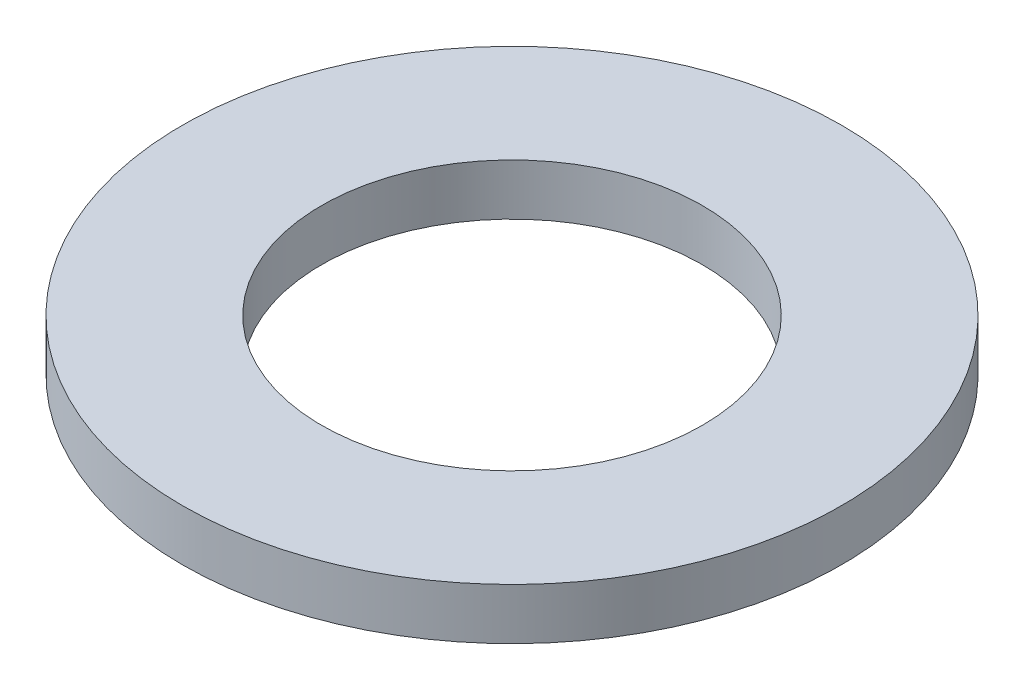
ISO-10303-21;
HEADER;
FILE_DESCRIPTION(('STEP AP214'),'2;1');
FILE_NAME('part.step','',(''),(''),'','','');
FILE_SCHEMA(('AUTOMOTIVE_DESIGN { 1 0 10303 214 1 1 1 1 }'));
ENDSEC;
DATA;
#1=APPLICATION_CONTEXT('core data for automotive mechanical design processes');
#2=APPLICATION_PROTOCOL_DEFINITION('international standard','automotive_design',2000,#1);
#3=PRODUCT_CONTEXT('',#1,'mechanical');
#4=PRODUCT('Part','Part','',(#3));
#5=PRODUCT_RELATED_PRODUCT_CATEGORY('part','',(#4));
#6=PRODUCT_DEFINITION_FORMATION('','',#4);
#7=PRODUCT_DEFINITION_CONTEXT('part definition',#1,'design');
#8=PRODUCT_DEFINITION('design','',#6,#7);
#9=PRODUCT_DEFINITION_SHAPE('','',#8);
#10=(LENGTH_UNIT() NAMED_UNIT(*) SI_UNIT(.MILLI.,.METRE.));
#11=(NAMED_UNIT(*) PLANE_ANGLE_UNIT() SI_UNIT($,.RADIAN.));
#12=(NAMED_UNIT(*) SI_UNIT($,.STERADIAN.) SOLID_ANGLE_UNIT());
#13=UNCERTAINTY_MEASURE_WITH_UNIT(LENGTH_MEASURE(1.E-05),#10,'distance_accuracy_value','');
#14=(GEOMETRIC_REPRESENTATION_CONTEXT(3) GLOBAL_UNCERTAINTY_ASSIGNED_CONTEXT((#13)) GLOBAL_UNIT_ASSIGNED_CONTEXT((#10,
#11,#12)) REPRESENTATION_CONTEXT('',''));
#15=CARTESIAN_POINT('',(0.,0.,0.));
#16=DIRECTION('',(0.,0.,1.));
#17=DIRECTION('',(1.,0.,0.));
#18=AXIS2_PLACEMENT_3D('',#15,#16,#17);
#19=CARTESIAN_POINT('',(0.,0.7,0.));
#20=DIRECTION('',(0.,1.,0.));
#21=DIRECTION('',(0.,0.,1.));
#22=AXIS2_PLACEMENT_3D('',#19,#20,#21);
#23=PLANE('',#22);
#24=CARTESIAN_POINT('',(0.,0.7,0.));
#25=DIRECTION('',(0.,1.,0.));
#26=DIRECTION('',(0.,0.,1.));
#27=AXIS2_PLACEMENT_3D('',#24,#25,#26);
#28=CIRCLE('',#27,4.5);
#29=CARTESIAN_POINT('',(0.,0.7,4.5));
#30=VERTEX_POINT('',#29);
#31=EDGE_CURVE('E11',#30,#30,#28,.T.);
#32=ORIENTED_EDGE('',*,*,#31,.T.);
#33=EDGE_LOOP('',(#32));
#34=FACE_BOUND('',#33,.T.);
#35=CARTESIAN_POINT('',(0.,0.7,0.));
#36=DIRECTION('',(0.,1.,0.));
#37=DIRECTION('',(1.,0.,0.));
#38=AXIS2_PLACEMENT_3D('',#35,#36,#37);
#39=CIRCLE('',#38,2.6);
#40=CARTESIAN_POINT('',(2.6,0.7,0.));
#41=VERTEX_POINT('',#40);
#42=EDGE_CURVE('E54',#41,#41,#39,.T.);
#43=ORIENTED_EDGE('',*,*,#42,.F.);
#44=EDGE_LOOP('',(#43));
#45=FACE_BOUND('',#44,.T.);
#46=ADVANCED_FACE('F43',(#34,#45),#23,.T.);
#47=CARTESIAN_POINT('',(0.,0.,0.));
#48=DIRECTION('',(0.,1.,0.));
#49=DIRECTION('',(0.,0.,1.));
#50=AXIS2_PLACEMENT_3D('',#47,#48,#49);
#51=PLANE('',#50);
#52=CARTESIAN_POINT('',(0.,0.,0.));
#53=DIRECTION('',(0.,1.,0.));
#54=DIRECTION('',(0.,0.,1.));
#55=AXIS2_PLACEMENT_3D('',#52,#53,#54);
#56=CIRCLE('',#55,4.5);
#57=CARTESIAN_POINT('',(0.,0.,4.5));
#58=VERTEX_POINT('',#57);
#59=EDGE_CURVE('E47',#58,#58,#56,.T.);
#60=ORIENTED_EDGE('',*,*,#59,.F.);
#61=EDGE_LOOP('',(#60));
#62=FACE_BOUND('',#61,.T.);
#63=CARTESIAN_POINT('',(0.,0.,0.));
#64=DIRECTION('',(0.,1.,0.));
#65=DIRECTION('',(1.,0.,0.));
#66=AXIS2_PLACEMENT_3D('',#63,#64,#65);
#67=CIRCLE('',#66,2.6);
#68=CARTESIAN_POINT('',(2.6,0.,0.));
#69=VERTEX_POINT('',#68);
#70=EDGE_CURVE('E56',#69,#69,#67,.T.);
#71=ORIENTED_EDGE('',*,*,#70,.T.);
#72=EDGE_LOOP('',(#71));
#73=FACE_BOUND('',#72,.T.);
#74=ADVANCED_FACE('F66',(#62,#73),#51,.F.);
#75=CARTESIAN_POINT('',(0.,0.7,0.));
#76=DIRECTION('',(0.,-1.,0.));
#77=DIRECTION('',(0.,0.,-1.));
#78=AXIS2_PLACEMENT_3D('',#75,#76,#77);
#79=CYLINDRICAL_SURFACE('',#78,4.5);
#80=ORIENTED_EDGE('',*,*,#31,.F.);
#81=EDGE_LOOP('',(#80));
#82=FACE_BOUND('',#81,.T.);
#83=ORIENTED_EDGE('',*,*,#59,.T.);
#84=EDGE_LOOP('',(#83));
#85=FACE_BOUND('',#84,.T.);
#86=ADVANCED_FACE('F45',(#82,#85),#79,.T.);
#87=CARTESIAN_POINT('',(0.,0.7,0.));
#88=DIRECTION('',(0.,-1.,0.));
#89=DIRECTION('',(0.,0.,-1.));
#90=AXIS2_PLACEMENT_3D('',#87,#88,#89);
#91=CYLINDRICAL_SURFACE('',#90,2.6);
#92=ORIENTED_EDGE('',*,*,#42,.T.);
#93=EDGE_LOOP('',(#92));
#94=FACE_BOUND('',#93,.T.);
#95=ORIENTED_EDGE('',*,*,#70,.F.);
#96=EDGE_LOOP('',(#95));
#97=FACE_BOUND('',#96,.T.);
#98=ADVANCED_FACE('F62',(#94,#97),#91,.F.);
#99=CLOSED_SHELL('',(#46,#74,#86,#98));
#100=MANIFOLD_SOLID_BREP('B2',#99);
#101=ADVANCED_BREP_SHAPE_REPRESENTATION('',(#18,#100),#14);
#102=SHAPE_DEFINITION_REPRESENTATION(#9,#101);
ENDSEC;
END-ISO-10303-21;
